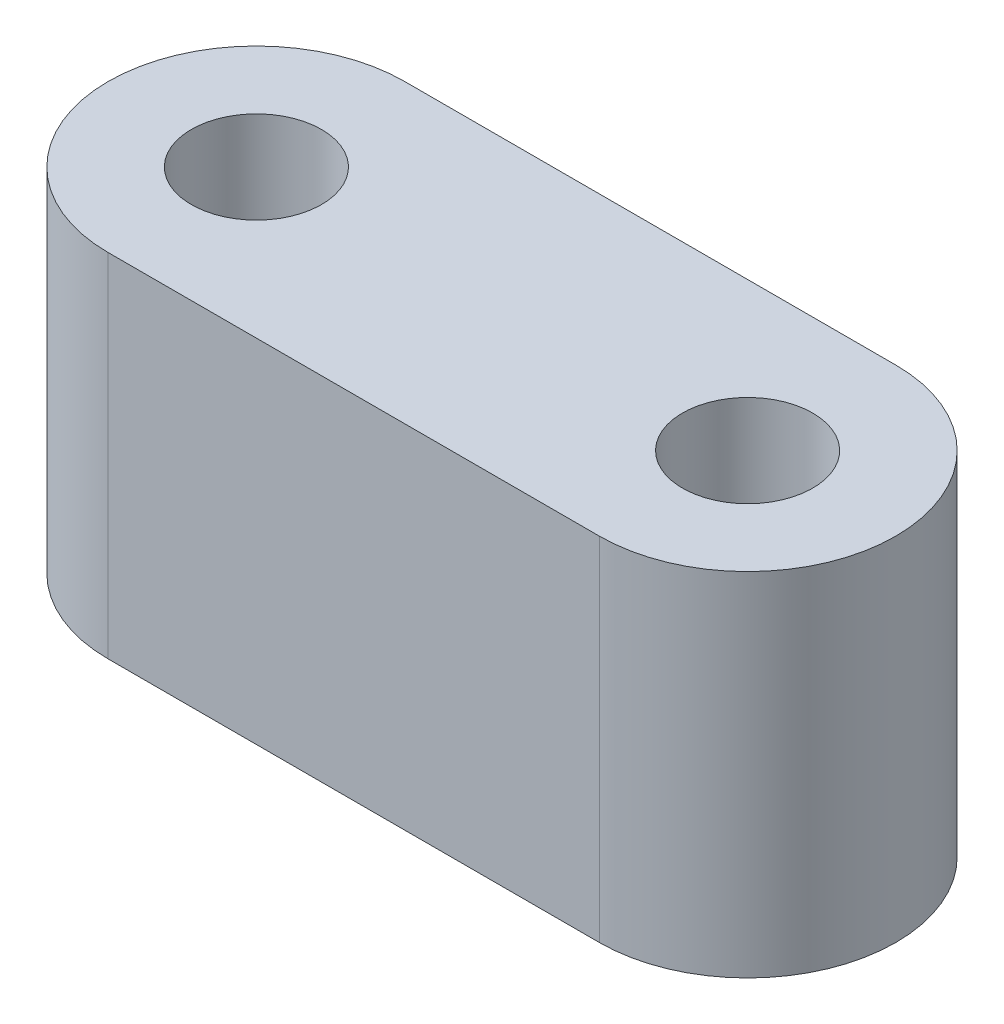
ISO-10303-21;
HEADER;
FILE_DESCRIPTION(('STEP AP214'),'2;1');
FILE_NAME('part.step','',(''),(''),'','','');
FILE_SCHEMA(('AUTOMOTIVE_DESIGN { 1 0 10303 214 1 1 1 1 }'));
ENDSEC;
DATA;
#1=APPLICATION_CONTEXT('core data for automotive mechanical design processes');
#2=APPLICATION_PROTOCOL_DEFINITION('international standard','automotive_design',2000,#1);
#3=PRODUCT_CONTEXT('',#1,'mechanical');
#4=PRODUCT('Part','Part','',(#3));
#5=PRODUCT_RELATED_PRODUCT_CATEGORY('part','',(#4));
#6=PRODUCT_DEFINITION_FORMATION('','',#4);
#7=PRODUCT_DEFINITION_CONTEXT('part definition',#1,'design');
#8=PRODUCT_DEFINITION('design','',#6,#7);
#9=PRODUCT_DEFINITION_SHAPE('','',#8);
#10=(LENGTH_UNIT() NAMED_UNIT(*) SI_UNIT(.MILLI.,.METRE.));
#11=(NAMED_UNIT(*) PLANE_ANGLE_UNIT() SI_UNIT($,.RADIAN.));
#12=(NAMED_UNIT(*) SI_UNIT($,.STERADIAN.) SOLID_ANGLE_UNIT());
#13=UNCERTAINTY_MEASURE_WITH_UNIT(LENGTH_MEASURE(1.E-05),#10,'distance_accuracy_value','');
#14=(GEOMETRIC_REPRESENTATION_CONTEXT(3) GLOBAL_UNCERTAINTY_ASSIGNED_CONTEXT((#13)) GLOBAL_UNIT_ASSIGNED_CONTEXT((#10,
#11,#12)) REPRESENTATION_CONTEXT('',''));
#15=CARTESIAN_POINT('',(0.,0.,0.));
#16=DIRECTION('',(0.,0.,1.));
#17=DIRECTION('',(1.,0.,0.));
#18=AXIS2_PLACEMENT_3D('',#15,#16,#17);
#19=CARTESIAN_POINT('',(-26.940764,19.304,0.));
#20=DIRECTION('',(0.,1.,0.));
#21=DIRECTION('',(0.,0.,1.));
#22=AXIS2_PLACEMENT_3D('',#19,#20,#21);
#23=PLANE('',#22);
#24=CARTESIAN_POINT('',(-26.940764,19.304,0.));
#25=DIRECTION('',(0.,1.,0.));
#26=DIRECTION('',(0.,0.,1.));
#27=AXIS2_PLACEMENT_3D('',#24,#25,#26);
#28=CIRCLE('',#27,8.128);
#29=CARTESIAN_POINT('',(-26.940764,19.304,-8.128));
#30=VERTEX_POINT('',#29);
#31=CARTESIAN_POINT('',(-26.940764,19.304,8.128));
#32=VERTEX_POINT('',#31);
#33=EDGE_CURVE('E91',#30,#32,#28,.T.);
#34=ORIENTED_EDGE('',*,*,#33,.T.);
#35=DIRECTION('',(1.,0.,0.));
#36=VECTOR('',#35,1.);
#37=CARTESIAN_POINT('',(-26.940764,19.304,8.128));
#38=LINE('',#37,#36);
#39=CARTESIAN_POINT('',(0.,19.304,8.128));
#40=VERTEX_POINT('',#39);
#41=EDGE_CURVE('E86',#32,#40,#38,.T.);
#42=ORIENTED_EDGE('',*,*,#41,.T.);
#43=CARTESIAN_POINT('',(0.,19.304,0.));
#44=DIRECTION('',(0.,1.,0.));
#45=DIRECTION('',(0.,0.,1.));
#46=AXIS2_PLACEMENT_3D('',#43,#44,#45);
#47=CIRCLE('',#46,8.128);
#48=CARTESIAN_POINT('',(0.,19.304,-8.128));
#49=VERTEX_POINT('',#48);
#50=EDGE_CURVE('E89',#40,#49,#47,.T.);
#51=ORIENTED_EDGE('',*,*,#50,.T.);
#52=DIRECTION('',(-1.,0.,0.));
#53=VECTOR('',#52,1.);
#54=CARTESIAN_POINT('',(-26.940764,19.304,-8.128));
#55=LINE('',#54,#53);
#56=EDGE_CURVE('E56',#49,#30,#55,.T.);
#57=ORIENTED_EDGE('',*,*,#56,.T.);
#58=EDGE_LOOP('',(#34,#42,#51,#57));
#59=FACE_BOUND('',#58,.T.);
#60=CARTESIAN_POINT('',(-26.940764,19.304,0.));
#61=DIRECTION('',(0.,-1.,0.));
#62=DIRECTION('',(0.,0.,-1.));
#63=AXIS2_PLACEMENT_3D('',#60,#61,#62);
#64=CIRCLE('',#63,3.57124);
#65=CARTESIAN_POINT('',(-26.940764,19.304,-3.57124));
#66=VERTEX_POINT('',#65);
#67=EDGE_CURVE('E106',#66,#66,#64,.T.);
#68=ORIENTED_EDGE('',*,*,#67,.T.);
#69=EDGE_LOOP('',(#68));
#70=FACE_BOUND('',#69,.T.);
#71=CARTESIAN_POINT('',(0.,19.304,0.));
#72=DIRECTION('',(0.,-1.,0.));
#73=DIRECTION('',(0.,0.,-1.));
#74=AXIS2_PLACEMENT_3D('',#71,#72,#73);
#75=CIRCLE('',#74,3.57124);
#76=CARTESIAN_POINT('',(0.,19.304,-3.57124));
#77=VERTEX_POINT('',#76);
#78=EDGE_CURVE('E122',#77,#77,#75,.T.);
#79=ORIENTED_EDGE('',*,*,#78,.T.);
#80=EDGE_LOOP('',(#79));
#81=FACE_BOUND('',#80,.T.);
#82=ADVANCED_FACE('F39',(#59,#70,#81),#23,.T.);
#83=CARTESIAN_POINT('',(-26.940764,19.304,0.));
#84=DIRECTION('',(0.,-1.,0.));
#85=DIRECTION('',(0.,0.,-1.));
#86=AXIS2_PLACEMENT_3D('',#83,#84,#85);
#87=CYLINDRICAL_SURFACE('',#86,8.128);
#88=CARTESIAN_POINT('',(-26.940764,0.,0.));
#89=DIRECTION('',(0.,1.,0.));
#90=DIRECTION('',(0.,0.,1.));
#91=AXIS2_PLACEMENT_3D('',#88,#89,#90);
#92=CIRCLE('',#91,8.128);
#93=CARTESIAN_POINT('',(-26.940764,0.,-8.128));
#94=VERTEX_POINT('',#93);
#95=CARTESIAN_POINT('',(-26.940764,0.,8.128));
#96=VERTEX_POINT('',#95);
#97=EDGE_CURVE('E103',#94,#96,#92,.T.);
#98=ORIENTED_EDGE('',*,*,#97,.T.);
#99=DIRECTION('',(0.,-1.,0.));
#100=VECTOR('',#99,1.);
#101=CARTESIAN_POINT('',(-26.940764,19.304,8.128));
#102=LINE('',#101,#100);
#103=EDGE_CURVE('E11',#32,#96,#102,.T.);
#104=ORIENTED_EDGE('',*,*,#103,.F.);
#105=ORIENTED_EDGE('',*,*,#33,.F.);
#106=DIRECTION('',(0.,-1.,0.));
#107=VECTOR('',#106,1.);
#108=CARTESIAN_POINT('',(-26.940764,19.304,-8.128));
#109=LINE('',#108,#107);
#110=EDGE_CURVE('E99',#30,#94,#109,.T.);
#111=ORIENTED_EDGE('',*,*,#110,.T.);
#112=EDGE_LOOP('',(#98,#104,#105,#111));
#113=FACE_BOUND('',#112,.T.);
#114=ADVANCED_FACE('F41',(#113),#87,.T.);
#115=CARTESIAN_POINT('',(-26.940764,19.304,8.128));
#116=DIRECTION('',(0.,0.,-1.));
#117=DIRECTION('',(-1.,0.,0.));
#118=AXIS2_PLACEMENT_3D('',#115,#116,#117);
#119=PLANE('',#118);
#120=DIRECTION('',(1.,0.,0.));
#121=VECTOR('',#120,1.);
#122=CARTESIAN_POINT('',(-26.940764,0.,8.128));
#123=LINE('',#122,#121);
#124=CARTESIAN_POINT('',(0.,0.,8.128));
#125=VERTEX_POINT('',#124);
#126=EDGE_CURVE('E95',#96,#125,#123,.T.);
#127=ORIENTED_EDGE('',*,*,#126,.T.);
#128=DIRECTION('',(0.,-1.,0.));
#129=VECTOR('',#128,1.);
#130=CARTESIAN_POINT('',(0.,19.304,8.128));
#131=LINE('',#130,#129);
#132=EDGE_CURVE('E48',#40,#125,#131,.T.);
#133=ORIENTED_EDGE('',*,*,#132,.F.);
#134=ORIENTED_EDGE('',*,*,#41,.F.);
#135=ORIENTED_EDGE('',*,*,#103,.T.);
#136=EDGE_LOOP('',(#127,#133,#134,#135));
#137=FACE_BOUND('',#136,.T.);
#138=ADVANCED_FACE('F94',(#137),#119,.F.);
#139=CARTESIAN_POINT('',(0.,19.304,0.));
#140=DIRECTION('',(0.,-1.,0.));
#141=DIRECTION('',(0.,0.,-1.));
#142=AXIS2_PLACEMENT_3D('',#139,#140,#141);
#143=CYLINDRICAL_SURFACE('',#142,8.128);
#144=CARTESIAN_POINT('',(0.,0.,0.));
#145=DIRECTION('',(0.,1.,0.));
#146=DIRECTION('',(0.,0.,1.));
#147=AXIS2_PLACEMENT_3D('',#144,#145,#146);
#148=CIRCLE('',#147,8.128);
#149=CARTESIAN_POINT('',(0.,0.,-8.128));
#150=VERTEX_POINT('',#149);
#151=EDGE_CURVE('E73',#125,#150,#148,.T.);
#152=ORIENTED_EDGE('',*,*,#151,.T.);
#153=DIRECTION('',(0.,-1.,0.));
#154=VECTOR('',#153,1.);
#155=CARTESIAN_POINT('',(0.,19.304,-8.128));
#156=LINE('',#155,#154);
#157=EDGE_CURVE('E96',#49,#150,#156,.T.);
#158=ORIENTED_EDGE('',*,*,#157,.F.);
#159=ORIENTED_EDGE('',*,*,#50,.F.);
#160=ORIENTED_EDGE('',*,*,#132,.T.);
#161=EDGE_LOOP('',(#152,#158,#159,#160));
#162=FACE_BOUND('',#161,.T.);
#163=ADVANCED_FACE('F97',(#162),#143,.T.);
#164=CARTESIAN_POINT('',(-26.940764,19.304,-8.128));
#165=DIRECTION('',(0.,0.,1.));
#166=DIRECTION('',(1.,0.,0.));
#167=AXIS2_PLACEMENT_3D('',#164,#165,#166);
#168=PLANE('',#167);
#169=DIRECTION('',(-1.,0.,0.));
#170=VECTOR('',#169,1.);
#171=CARTESIAN_POINT('',(-26.940764,0.,-8.128));
#172=LINE('',#171,#170);
#173=EDGE_CURVE('E79',#150,#94,#172,.T.);
#174=ORIENTED_EDGE('',*,*,#173,.T.);
#175=ORIENTED_EDGE('',*,*,#110,.F.);
#176=ORIENTED_EDGE('',*,*,#56,.F.);
#177=ORIENTED_EDGE('',*,*,#157,.T.);
#178=EDGE_LOOP('',(#174,#175,#176,#177));
#179=FACE_BOUND('',#178,.T.);
#180=ADVANCED_FACE('F111',(#179),#168,.F.);
#181=CARTESIAN_POINT('',(-26.940764,0.,0.));
#182=DIRECTION('',(0.,1.,0.));
#183=DIRECTION('',(0.,0.,1.));
#184=AXIS2_PLACEMENT_3D('',#181,#182,#183);
#185=PLANE('',#184);
#186=CARTESIAN_POINT('',(0.,0.,0.));
#187=DIRECTION('',(0.,-1.,0.));
#188=DIRECTION('',(0.,0.,-1.));
#189=AXIS2_PLACEMENT_3D('',#186,#187,#188);
#190=CIRCLE('',#189,3.57124);
#191=CARTESIAN_POINT('',(0.,0.,-3.57124));
#192=VERTEX_POINT('',#191);
#193=EDGE_CURVE('E125',#192,#192,#190,.T.);
#194=ORIENTED_EDGE('',*,*,#193,.F.);
#195=EDGE_LOOP('',(#194));
#196=FACE_BOUND('',#195,.T.);
#197=CARTESIAN_POINT('',(-26.940764,0.,0.));
#198=DIRECTION('',(0.,-1.,0.));
#199=DIRECTION('',(0.,0.,-1.));
#200=AXIS2_PLACEMENT_3D('',#197,#198,#199);
#201=CIRCLE('',#200,3.57124);
#202=CARTESIAN_POINT('',(-26.940764,0.,-3.57124));
#203=VERTEX_POINT('',#202);
#204=EDGE_CURVE('E119',#203,#203,#201,.T.);
#205=ORIENTED_EDGE('',*,*,#204,.F.);
#206=EDGE_LOOP('',(#205));
#207=FACE_BOUND('',#206,.T.);
#208=ORIENTED_EDGE('',*,*,#97,.F.);
#209=ORIENTED_EDGE('',*,*,#173,.F.);
#210=ORIENTED_EDGE('',*,*,#151,.F.);
#211=ORIENTED_EDGE('',*,*,#126,.F.);
#212=EDGE_LOOP('',(#208,#209,#210,#211));
#213=FACE_BOUND('',#212,.T.);
#214=ADVANCED_FACE('F114',(#196,#207,#213),#185,.F.);
#215=CARTESIAN_POINT('',(-26.940764,0.,0.));
#216=DIRECTION('',(0.,-1.,0.));
#217=DIRECTION('',(0.,0.,-1.));
#218=AXIS2_PLACEMENT_3D('',#215,#216,#217);
#219=CYLINDRICAL_SURFACE('',#218,3.57124);
#220=ORIENTED_EDGE('',*,*,#67,.F.);
#221=EDGE_LOOP('',(#220));
#222=FACE_BOUND('',#221,.T.);
#223=ORIENTED_EDGE('',*,*,#204,.T.);
#224=EDGE_LOOP('',(#223));
#225=FACE_BOUND('',#224,.T.);
#226=ADVANCED_FACE('F133',(#222,#225),#219,.F.);
#227=CARTESIAN_POINT('',(0.,0.,0.));
#228=DIRECTION('',(0.,-1.,0.));
#229=DIRECTION('',(0.,0.,-1.));
#230=AXIS2_PLACEMENT_3D('',#227,#228,#229);
#231=CYLINDRICAL_SURFACE('',#230,3.57124);
#232=ORIENTED_EDGE('',*,*,#78,.F.);
#233=EDGE_LOOP('',(#232));
#234=FACE_BOUND('',#233,.T.);
#235=ORIENTED_EDGE('',*,*,#193,.T.);
#236=EDGE_LOOP('',(#235));
#237=FACE_BOUND('',#236,.T.);
#238=ADVANCED_FACE('F129',(#234,#237),#231,.F.);
#239=CLOSED_SHELL('',(#82,#114,#138,#163,#180,#214,#226,#238));
#240=MANIFOLD_SOLID_BREP('B2',#239);
#241=ADVANCED_BREP_SHAPE_REPRESENTATION('',(#18,#240),#14);
#242=SHAPE_DEFINITION_REPRESENTATION(#9,#241);
ENDSEC;
END-ISO-10303-21;
